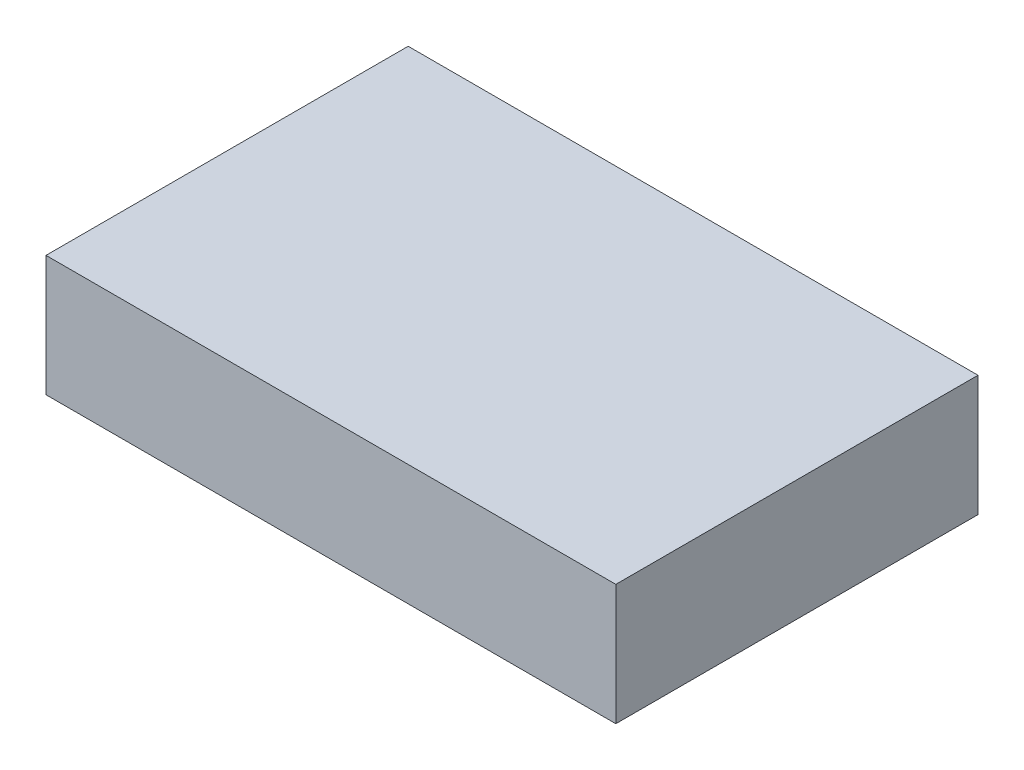
ISO-10303-21;
HEADER;
FILE_DESCRIPTION(('STEP AP214'),'2;1');
FILE_NAME('part.step','',(''),(''),'','','');
FILE_SCHEMA(('AUTOMOTIVE_DESIGN { 1 0 10303 214 1 1 1 1 }'));
ENDSEC;
DATA;
#1=APPLICATION_CONTEXT('core data for automotive mechanical design processes');
#2=APPLICATION_PROTOCOL_DEFINITION('international standard','automotive_design',2000,#1);
#3=PRODUCT_CONTEXT('',#1,'mechanical');
#4=PRODUCT('Part','Part','',(#3));
#5=PRODUCT_RELATED_PRODUCT_CATEGORY('part','',(#4));
#6=PRODUCT_DEFINITION_FORMATION('','',#4);
#7=PRODUCT_DEFINITION_CONTEXT('part definition',#1,'design');
#8=PRODUCT_DEFINITION('design','',#6,#7);
#9=PRODUCT_DEFINITION_SHAPE('','',#8);
#10=(LENGTH_UNIT() NAMED_UNIT(*) SI_UNIT(.MILLI.,.METRE.));
#11=(NAMED_UNIT(*) PLANE_ANGLE_UNIT() SI_UNIT($,.RADIAN.));
#12=(NAMED_UNIT(*) SI_UNIT($,.STERADIAN.) SOLID_ANGLE_UNIT());
#13=UNCERTAINTY_MEASURE_WITH_UNIT(LENGTH_MEASURE(1.E-05),#10,'distance_accuracy_value','');
#14=(GEOMETRIC_REPRESENTATION_CONTEXT(3) GLOBAL_UNCERTAINTY_ASSIGNED_CONTEXT((#13)) GLOBAL_UNIT_ASSIGNED_CONTEXT((#10,
#11,#12)) REPRESENTATION_CONTEXT('',''));
#15=CARTESIAN_POINT('',(0.,0.,0.));
#16=DIRECTION('',(0.,0.,1.));
#17=DIRECTION('',(1.,0.,0.));
#18=AXIS2_PLACEMENT_3D('',#15,#16,#17);
#19=CARTESIAN_POINT('',(32.3160854040932,6.35,-16.2330827067669));
#20=DIRECTION('',(1.,0.,0.));
#21=DIRECTION('',(0.,0.,-1.));
#22=AXIS2_PLACEMENT_3D('',#19,#20,#21);
#23=PLANE('',#22);
#24=DIRECTION('',(0.,0.,1.));
#25=VECTOR('',#24,1.);
#26=CARTESIAN_POINT('',(32.3160854040932,0.,-16.2330827067669));
#27=LINE('',#26,#25);
#28=CARTESIAN_POINT('',(32.3160854040932,0.,-16.2330827067669));
#29=VERTEX_POINT('',#28);
#30=CARTESIAN_POINT('',(32.3160854040932,0.,2.81691729323308));
#31=VERTEX_POINT('',#30);
#32=EDGE_CURVE('E96',#29,#31,#27,.T.);
#33=ORIENTED_EDGE('',*,*,#32,.T.);
#34=DIRECTION('',(0.,-1.,0.));
#35=VECTOR('',#34,1.);
#36=CARTESIAN_POINT('',(32.3160854040932,6.35,2.81691729323308));
#37=LINE('',#36,#35);
#38=CARTESIAN_POINT('',(32.3160854040932,6.35,2.81691729323308));
#39=VERTEX_POINT('',#38);
#40=EDGE_CURVE('E11',#39,#31,#37,.T.);
#41=ORIENTED_EDGE('',*,*,#40,.F.);
#42=DIRECTION('',(0.,0.,1.));
#43=VECTOR('',#42,1.);
#44=CARTESIAN_POINT('',(32.3160854040932,6.35,-16.2330827067669));
#45=LINE('',#44,#43);
#46=CARTESIAN_POINT('',(32.3160854040932,6.35,-16.2330827067669));
#47=VERTEX_POINT('',#46);
#48=EDGE_CURVE('E84',#47,#39,#45,.T.);
#49=ORIENTED_EDGE('',*,*,#48,.F.);
#50=DIRECTION('',(0.,-1.,0.));
#51=VECTOR('',#50,1.);
#52=CARTESIAN_POINT('',(32.3160854040932,6.35,-16.2330827067669));
#53=LINE('',#52,#51);
#54=EDGE_CURVE('E92',#47,#29,#53,.T.);
#55=ORIENTED_EDGE('',*,*,#54,.T.);
#56=EDGE_LOOP('',(#33,#41,#49,#55));
#57=FACE_BOUND('',#56,.T.);
#58=ADVANCED_FACE('F33',(#57),#23,.F.);
#59=CARTESIAN_POINT('',(32.3160854040932,6.35,2.81691729323308));
#60=DIRECTION('',(0.,0.,-1.));
#61=DIRECTION('',(-1.,0.,0.));
#62=AXIS2_PLACEMENT_3D('',#59,#60,#61);
#63=PLANE('',#62);
#64=DIRECTION('',(1.,0.,0.));
#65=VECTOR('',#64,1.);
#66=CARTESIAN_POINT('',(32.3160854040932,0.,2.81691729323308));
#67=LINE('',#66,#65);
#68=CARTESIAN_POINT('',(62.2880854040932,0.,2.81691729323308));
#69=VERTEX_POINT('',#68);
#70=EDGE_CURVE('E88',#31,#69,#67,.T.);
#71=ORIENTED_EDGE('',*,*,#70,.T.);
#72=DIRECTION('',(0.,-1.,0.));
#73=VECTOR('',#72,1.);
#74=CARTESIAN_POINT('',(62.2880854040932,6.35,2.81691729323308));
#75=LINE('',#74,#73);
#76=CARTESIAN_POINT('',(62.2880854040932,6.35,2.81691729323308));
#77=VERTEX_POINT('',#76);
#78=EDGE_CURVE('E41',#77,#69,#75,.T.);
#79=ORIENTED_EDGE('',*,*,#78,.F.);
#80=DIRECTION('',(1.,0.,0.));
#81=VECTOR('',#80,1.);
#82=CARTESIAN_POINT('',(32.3160854040932,6.35,2.81691729323308));
#83=LINE('',#82,#81);
#84=EDGE_CURVE('E79',#39,#77,#83,.T.);
#85=ORIENTED_EDGE('',*,*,#84,.F.);
#86=ORIENTED_EDGE('',*,*,#40,.T.);
#87=EDGE_LOOP('',(#71,#79,#85,#86));
#88=FACE_BOUND('',#87,.T.);
#89=ADVANCED_FACE('F87',(#88),#63,.F.);
#90=CARTESIAN_POINT('',(62.2880854040932,6.35,-16.2330827067669));
#91=DIRECTION('',(-1.,0.,0.));
#92=DIRECTION('',(0.,0.,1.));
#93=AXIS2_PLACEMENT_3D('',#90,#91,#92);
#94=PLANE('',#93);
#95=DIRECTION('',(0.,0.,-1.));
#96=VECTOR('',#95,1.);
#97=CARTESIAN_POINT('',(62.2880854040932,0.,-16.2330827067669));
#98=LINE('',#97,#96);
#99=CARTESIAN_POINT('',(62.2880854040932,0.,-16.2330827067669));
#100=VERTEX_POINT('',#99);
#101=EDGE_CURVE('E66',#69,#100,#98,.T.);
#102=ORIENTED_EDGE('',*,*,#101,.T.);
#103=DIRECTION('',(0.,-1.,0.));
#104=VECTOR('',#103,1.);
#105=CARTESIAN_POINT('',(62.2880854040932,6.35,-16.2330827067669));
#106=LINE('',#105,#104);
#107=CARTESIAN_POINT('',(62.2880854040932,6.35,-16.2330827067669));
#108=VERTEX_POINT('',#107);
#109=EDGE_CURVE('E89',#108,#100,#106,.T.);
#110=ORIENTED_EDGE('',*,*,#109,.F.);
#111=DIRECTION('',(0.,0.,-1.));
#112=VECTOR('',#111,1.);
#113=CARTESIAN_POINT('',(62.2880854040932,6.35,-16.2330827067669));
#114=LINE('',#113,#112);
#115=EDGE_CURVE('E82',#77,#108,#114,.T.);
#116=ORIENTED_EDGE('',*,*,#115,.F.);
#117=ORIENTED_EDGE('',*,*,#78,.T.);
#118=EDGE_LOOP('',(#102,#110,#116,#117));
#119=FACE_BOUND('',#118,.T.);
#120=ADVANCED_FACE('F90',(#119),#94,.F.);
#121=CARTESIAN_POINT('',(32.3160854040932,6.35,-16.2330827067669));
#122=DIRECTION('',(0.,0.,1.));
#123=DIRECTION('',(1.,0.,0.));
#124=AXIS2_PLACEMENT_3D('',#121,#122,#123);
#125=PLANE('',#124);
#126=DIRECTION('',(-1.,0.,0.));
#127=VECTOR('',#126,1.);
#128=CARTESIAN_POINT('',(32.3160854040932,0.,-16.2330827067669));
#129=LINE('',#128,#127);
#130=EDGE_CURVE('E72',#100,#29,#129,.T.);
#131=ORIENTED_EDGE('',*,*,#130,.T.);
#132=ORIENTED_EDGE('',*,*,#54,.F.);
#133=DIRECTION('',(-1.,0.,0.));
#134=VECTOR('',#133,1.);
#135=CARTESIAN_POINT('',(32.3160854040932,6.35,-16.2330827067669));
#136=LINE('',#135,#134);
#137=EDGE_CURVE('E49',#108,#47,#136,.T.);
#138=ORIENTED_EDGE('',*,*,#137,.F.);
#139=ORIENTED_EDGE('',*,*,#109,.T.);
#140=EDGE_LOOP('',(#131,#132,#138,#139));
#141=FACE_BOUND('',#140,.T.);
#142=ADVANCED_FACE('F103',(#141),#125,.F.);
#143=CARTESIAN_POINT('',(0.,6.35,0.));
#144=DIRECTION('',(0.,1.,0.));
#145=DIRECTION('',(0.,0.,1.));
#146=AXIS2_PLACEMENT_3D('',#143,#144,#145);
#147=PLANE('',#146);
#148=ORIENTED_EDGE('',*,*,#48,.T.);
#149=ORIENTED_EDGE('',*,*,#84,.T.);
#150=ORIENTED_EDGE('',*,*,#115,.T.);
#151=ORIENTED_EDGE('',*,*,#137,.T.);
#152=EDGE_LOOP('',(#148,#149,#150,#151));
#153=FACE_BOUND('',#152,.T.);
#154=ADVANCED_FACE('F80',(#153),#147,.T.);
#155=CARTESIAN_POINT('',(0.,0.,0.));
#156=DIRECTION('',(0.,1.,0.));
#157=DIRECTION('',(0.,0.,1.));
#158=AXIS2_PLACEMENT_3D('',#155,#156,#157);
#159=PLANE('',#158);
#160=ORIENTED_EDGE('',*,*,#32,.F.);
#161=ORIENTED_EDGE('',*,*,#130,.F.);
#162=ORIENTED_EDGE('',*,*,#101,.F.);
#163=ORIENTED_EDGE('',*,*,#70,.F.);
#164=EDGE_LOOP('',(#160,#161,#162,#163));
#165=FACE_BOUND('',#164,.T.);
#166=ADVANCED_FACE('F106',(#165),#159,.F.);
#167=CLOSED_SHELL('',(#58,#89,#120,#142,#154,#166));
#168=MANIFOLD_SOLID_BREP('B2',#167);
#169=ADVANCED_BREP_SHAPE_REPRESENTATION('',(#18,#168),#14);
#170=SHAPE_DEFINITION_REPRESENTATION(#9,#169);
ENDSEC;
END-ISO-10303-21;
